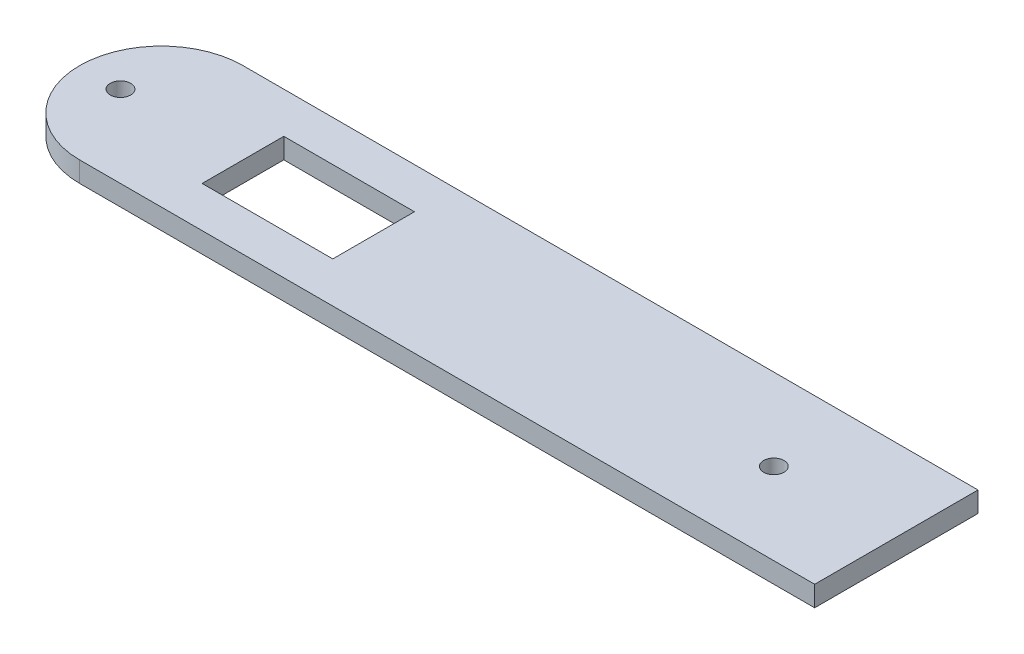
ISO-10303-21;
HEADER;
FILE_DESCRIPTION(('STEP AP214'),'2;1');
FILE_NAME('part.step','',(''),(''),'','','');
FILE_SCHEMA(('AUTOMOTIVE_DESIGN { 1 0 10303 214 1 1 1 1 }'));
ENDSEC;
DATA;
#1=APPLICATION_CONTEXT('core data for automotive mechanical design processes');
#2=APPLICATION_PROTOCOL_DEFINITION('international standard','automotive_design',2000,#1);
#3=PRODUCT_CONTEXT('',#1,'mechanical');
#4=PRODUCT('Part','Part','',(#3));
#5=PRODUCT_RELATED_PRODUCT_CATEGORY('part','',(#4));
#6=PRODUCT_DEFINITION_FORMATION('','',#4);
#7=PRODUCT_DEFINITION_CONTEXT('part definition',#1,'design');
#8=PRODUCT_DEFINITION('design','',#6,#7);
#9=PRODUCT_DEFINITION_SHAPE('','',#8);
#10=(LENGTH_UNIT() NAMED_UNIT(*) SI_UNIT(.MILLI.,.METRE.));
#11=(NAMED_UNIT(*) PLANE_ANGLE_UNIT() SI_UNIT($,.RADIAN.));
#12=(NAMED_UNIT(*) SI_UNIT($,.STERADIAN.) SOLID_ANGLE_UNIT());
#13=UNCERTAINTY_MEASURE_WITH_UNIT(LENGTH_MEASURE(1.E-05),#10,'distance_accuracy_value','');
#14=(GEOMETRIC_REPRESENTATION_CONTEXT(3) GLOBAL_UNCERTAINTY_ASSIGNED_CONTEXT((#13)) GLOBAL_UNIT_ASSIGNED_CONTEXT((#10,
#11,#12)) REPRESENTATION_CONTEXT('',''));
#15=CARTESIAN_POINT('',(0.,0.,0.));
#16=DIRECTION('',(0.,0.,1.));
#17=DIRECTION('',(1.,0.,0.));
#18=AXIS2_PLACEMENT_3D('',#15,#16,#17);
#19=CARTESIAN_POINT('',(-34.1213032581454,6.35,15.4691729323308));
#20=DIRECTION('',(0.,0.,-1.));
#21=DIRECTION('',(-1.,0.,0.));
#22=AXIS2_PLACEMENT_3D('',#19,#20,#21);
#23=PLANE('',#22);
#24=DIRECTION('',(1.,0.,0.));
#25=VECTOR('',#24,1.);
#26=CARTESIAN_POINT('',(-34.1213032581454,6.35,15.4691729323308));
#27=LINE('',#26,#25);
#28=CARTESIAN_POINT('',(-8.72130325814537,6.35,15.4691729323308));
#29=VERTEX_POINT('',#28);
#30=CARTESIAN_POINT('',(219.878696741855,6.35,15.4691729323308));
#31=VERTEX_POINT('',#30);
#32=EDGE_CURVE('E147',#29,#31,#27,.T.);
#33=ORIENTED_EDGE('',*,*,#32,.F.);
#34=DIRECTION('',(0.,-1.,0.));
#35=VECTOR('',#34,1.);
#36=CARTESIAN_POINT('',(-8.72130325814537,6.35,15.4691729323308));
#37=LINE('',#36,#35);
#38=CARTESIAN_POINT('',(-8.72130325814537,0.,15.4691729323308));
#39=VERTEX_POINT('',#38);
#40=EDGE_CURVE('E166',#29,#39,#37,.T.);
#41=ORIENTED_EDGE('',*,*,#40,.T.);
#42=DIRECTION('',(1.,0.,0.));
#43=VECTOR('',#42,1.);
#44=CARTESIAN_POINT('',(-34.1213032581454,0.,15.4691729323308));
#45=LINE('',#44,#43);
#46=CARTESIAN_POINT('',(219.878696741855,0.,15.4691729323308));
#47=VERTEX_POINT('',#46);
#48=EDGE_CURVE('E146',#39,#47,#45,.T.);
#49=ORIENTED_EDGE('',*,*,#48,.T.);
#50=DIRECTION('',(0.,-1.,0.));
#51=VECTOR('',#50,1.);
#52=CARTESIAN_POINT('',(219.878696741855,6.35,15.4691729323308));
#53=LINE('',#52,#51);
#54=EDGE_CURVE('E163',#31,#47,#53,.T.);
#55=ORIENTED_EDGE('',*,*,#54,.F.);
#56=EDGE_LOOP('',(#33,#41,#49,#55));
#57=FACE_BOUND('',#56,.T.);
#58=ADVANCED_FACE('F35',(#57),#23,.F.);
#59=CARTESIAN_POINT('',(219.878696741855,6.35,15.4691729323308));
#60=DIRECTION('',(-1.,0.,0.));
#61=DIRECTION('',(0.,0.,1.));
#62=AXIS2_PLACEMENT_3D('',#59,#60,#61);
#63=PLANE('',#62);
#64=DIRECTION('',(0.,0.,-1.));
#65=VECTOR('',#64,1.);
#66=CARTESIAN_POINT('',(219.878696741855,0.,15.4691729323308));
#67=LINE('',#66,#65);
#68=CARTESIAN_POINT('',(219.878696741855,0.,-35.3308270676692));
#69=VERTEX_POINT('',#68);
#70=EDGE_CURVE('E157',#47,#69,#67,.T.);
#71=ORIENTED_EDGE('',*,*,#70,.T.);
#72=DIRECTION('',(0.,-1.,0.));
#73=VECTOR('',#72,1.);
#74=CARTESIAN_POINT('',(219.878696741855,6.35,-35.3308270676692));
#75=LINE('',#74,#73);
#76=CARTESIAN_POINT('',(219.878696741855,6.35,-35.3308270676692));
#77=VERTEX_POINT('',#76);
#78=EDGE_CURVE('E155',#77,#69,#75,.T.);
#79=ORIENTED_EDGE('',*,*,#78,.F.);
#80=DIRECTION('',(0.,0.,-1.));
#81=VECTOR('',#80,1.);
#82=CARTESIAN_POINT('',(219.878696741855,6.35,15.4691729323308));
#83=LINE('',#82,#81);
#84=EDGE_CURVE('E149',#31,#77,#83,.T.);
#85=ORIENTED_EDGE('',*,*,#84,.F.);
#86=ORIENTED_EDGE('',*,*,#54,.T.);
#87=EDGE_LOOP('',(#71,#79,#85,#86));
#88=FACE_BOUND('',#87,.T.);
#89=ADVANCED_FACE('F204',(#88),#63,.F.);
#90=CARTESIAN_POINT('',(-34.1213032581454,6.35,-35.3308270676692));
#91=DIRECTION('',(0.,0.,1.));
#92=DIRECTION('',(1.,0.,0.));
#93=AXIS2_PLACEMENT_3D('',#90,#91,#92);
#94=PLANE('',#93);
#95=DIRECTION('',(-1.,0.,0.));
#96=VECTOR('',#95,1.);
#97=CARTESIAN_POINT('',(-34.1213032581454,0.,-35.3308270676692));
#98=LINE('',#97,#96);
#99=CARTESIAN_POINT('',(-8.72130325814537,0.,-35.3308270676692));
#100=VERTEX_POINT('',#99);
#101=EDGE_CURVE('E150',#69,#100,#98,.T.);
#102=ORIENTED_EDGE('',*,*,#101,.T.);
#103=DIRECTION('',(0.,-1.,0.));
#104=VECTOR('',#103,1.);
#105=CARTESIAN_POINT('',(-8.72130325814537,6.35,-35.3308270676692));
#106=LINE('',#105,#104);
#107=CARTESIAN_POINT('',(-8.72130325814537,6.35,-35.3308270676692));
#108=VERTEX_POINT('',#107);
#109=EDGE_CURVE('E177',#100,#108,#106,.F.);
#110=ORIENTED_EDGE('',*,*,#109,.T.);
#111=DIRECTION('',(-1.,0.,0.));
#112=VECTOR('',#111,1.);
#113=CARTESIAN_POINT('',(-34.1213032581454,6.35,-35.3308270676692));
#114=LINE('',#113,#112);
#115=EDGE_CURVE('E152',#77,#108,#114,.T.);
#116=ORIENTED_EDGE('',*,*,#115,.F.);
#117=ORIENTED_EDGE('',*,*,#78,.T.);
#118=EDGE_LOOP('',(#102,#110,#116,#117));
#119=FACE_BOUND('',#118,.T.);
#120=ADVANCED_FACE('F210',(#119),#94,.F.);
#121=CARTESIAN_POINT('',(0.,6.35,0.));
#122=DIRECTION('',(0.,-1.,0.));
#123=DIRECTION('',(0.,0.,-1.));
#124=AXIS2_PLACEMENT_3D('',#121,#122,#123);
#125=PLANE('',#124);
#126=DIRECTION('',(1.,0.,0.));
#127=VECTOR('',#126,1.);
#128=CARTESIAN_POINT('',(16.6786967418547,6.35,2.76917293233083));
#129=LINE('',#128,#127);
#130=CARTESIAN_POINT('',(16.6786967418547,6.35,2.76917293233083));
#131=VERTEX_POINT('',#130);
#132=CARTESIAN_POINT('',(57.3186967418547,6.35,2.76917293233083));
#133=VERTEX_POINT('',#132);
#134=EDGE_CURVE('E117',#131,#133,#129,.T.);
#135=ORIENTED_EDGE('',*,*,#134,.F.);
#136=DIRECTION('',(0.,0.,1.));
#137=VECTOR('',#136,1.);
#138=CARTESIAN_POINT('',(16.6786967418547,6.35,-22.6308270676692));
#139=LINE('',#138,#137);
#140=CARTESIAN_POINT('',(16.6786967418547,6.35,-22.6308270676692));
#141=VERTEX_POINT('',#140);
#142=EDGE_CURVE('E50',#141,#131,#139,.T.);
#143=ORIENTED_EDGE('',*,*,#142,.F.);
#144=DIRECTION('',(-1.,0.,0.));
#145=VECTOR('',#144,1.);
#146=CARTESIAN_POINT('',(16.6786967418547,6.35,-22.6308270676692));
#147=LINE('',#146,#145);
#148=CARTESIAN_POINT('',(57.3186967418547,6.35,-22.6308270676692));
#149=VERTEX_POINT('',#148);
#150=EDGE_CURVE('E124',#149,#141,#147,.T.);
#151=ORIENTED_EDGE('',*,*,#150,.F.);
#152=DIRECTION('',(0.,0.,-1.));
#153=VECTOR('',#152,1.);
#154=CARTESIAN_POINT('',(57.3186967418547,6.35,-22.6308270676692));
#155=LINE('',#154,#153);
#156=EDGE_CURVE('E108',#133,#149,#155,.T.);
#157=ORIENTED_EDGE('',*,*,#156,.F.);
#158=EDGE_LOOP('',(#135,#143,#151,#157));
#159=FACE_BOUND('',#158,.T.);
#160=CARTESIAN_POINT('',(-21.4213032581453,6.35,-9.93082706766917));
#161=DIRECTION('',(0.,1.,0.));
#162=DIRECTION('',(0.,0.,1.));
#163=AXIS2_PLACEMENT_3D('',#160,#161,#162);
#164=CIRCLE('',#163,3.17499999999999);
#165=CARTESIAN_POINT('',(-21.4213032581453,6.35,-6.75582706766918));
#166=VERTEX_POINT('',#165);
#167=EDGE_CURVE('E134',#166,#166,#164,.T.);
#168=ORIENTED_EDGE('',*,*,#167,.F.);
#169=EDGE_LOOP('',(#168));
#170=FACE_BOUND('',#169,.T.);
#171=CARTESIAN_POINT('',(181.778696741855,6.35,-9.93082706766917));
#172=DIRECTION('',(0.,1.,0.));
#173=DIRECTION('',(0.,0.,1.));
#174=AXIS2_PLACEMENT_3D('',#171,#172,#173);
#175=CIRCLE('',#174,3.17499999999998);
#176=CARTESIAN_POINT('',(181.778696741855,6.35,-6.75582706766919));
#177=VERTEX_POINT('',#176);
#178=EDGE_CURVE('E140',#177,#177,#175,.T.);
#179=ORIENTED_EDGE('',*,*,#178,.F.);
#180=EDGE_LOOP('',(#179));
#181=FACE_BOUND('',#180,.T.);
#182=CARTESIAN_POINT('',(-8.72130325814537,6.35,-9.93082706766917));
#183=DIRECTION('',(0.,-1.,0.));
#184=DIRECTION('',(0.,0.,-1.));
#185=AXIS2_PLACEMENT_3D('',#182,#183,#184);
#186=CIRCLE('',#185,25.4);
#187=CARTESIAN_POINT('',(-34.1213032581454,6.35,-9.93082706766917));
#188=VERTEX_POINT('',#187);
#189=EDGE_CURVE('E173',#108,#188,#186,.F.);
#190=ORIENTED_EDGE('',*,*,#189,.T.);
#191=CARTESIAN_POINT('',(-8.72130325814537,6.35,-9.93082706766918));
#192=DIRECTION('',(0.,-1.,0.));
#193=DIRECTION('',(0.,0.,-1.));
#194=AXIS2_PLACEMENT_3D('',#191,#192,#193);
#195=CIRCLE('',#194,25.4);
#196=EDGE_CURVE('E175',#188,#29,#195,.F.);
#197=ORIENTED_EDGE('',*,*,#196,.T.);
#198=ORIENTED_EDGE('',*,*,#32,.T.);
#199=ORIENTED_EDGE('',*,*,#84,.T.);
#200=ORIENTED_EDGE('',*,*,#115,.T.);
#201=EDGE_LOOP('',(#190,#197,#198,#199,#200));
#202=FACE_BOUND('',#201,.T.);
#203=ADVANCED_FACE('F121',(#159,#170,#181,#202),#125,.F.);
#204=CARTESIAN_POINT('',(0.,0.,0.));
#205=DIRECTION('',(0.,-1.,0.));
#206=DIRECTION('',(0.,0.,-1.));
#207=AXIS2_PLACEMENT_3D('',#204,#205,#206);
#208=PLANE('',#207);
#209=DIRECTION('',(0.,0.,-1.));
#210=VECTOR('',#209,1.);
#211=CARTESIAN_POINT('',(16.6786967418547,0.,0.));
#212=LINE('',#211,#210);
#213=CARTESIAN_POINT('',(16.6786967418547,0.,2.76917293233083));
#214=VERTEX_POINT('',#213);
#215=CARTESIAN_POINT('',(16.6786967418547,0.,-22.6308270676692));
#216=VERTEX_POINT('',#215);
#217=EDGE_CURVE('E11',#214,#216,#212,.T.);
#218=ORIENTED_EDGE('',*,*,#217,.F.);
#219=DIRECTION('',(-1.,0.,0.));
#220=VECTOR('',#219,1.);
#221=CARTESIAN_POINT('',(0.,0.,2.76917293233083));
#222=LINE('',#221,#220);
#223=CARTESIAN_POINT('',(57.3186967418547,0.,2.76917293233083));
#224=VERTEX_POINT('',#223);
#225=EDGE_CURVE('E179',#224,#214,#222,.T.);
#226=ORIENTED_EDGE('',*,*,#225,.F.);
#227=DIRECTION('',(0.,0.,1.));
#228=VECTOR('',#227,1.);
#229=CARTESIAN_POINT('',(57.3186967418547,0.,0.));
#230=LINE('',#229,#228);
#231=CARTESIAN_POINT('',(57.3186967418547,0.,-22.6308270676692));
#232=VERTEX_POINT('',#231);
#233=EDGE_CURVE('E111',#232,#224,#230,.T.);
#234=ORIENTED_EDGE('',*,*,#233,.F.);
#235=DIRECTION('',(1.,0.,0.));
#236=VECTOR('',#235,1.);
#237=CARTESIAN_POINT('',(0.,0.,-22.6308270676692));
#238=LINE('',#237,#236);
#239=EDGE_CURVE('E43',#216,#232,#238,.T.);
#240=ORIENTED_EDGE('',*,*,#239,.F.);
#241=EDGE_LOOP('',(#218,#226,#234,#240));
#242=FACE_BOUND('',#241,.T.);
#243=CARTESIAN_POINT('',(-21.4213032581453,0.,-9.93082706766917));
#244=DIRECTION('',(0.,1.,0.));
#245=DIRECTION('',(0.,0.,1.));
#246=AXIS2_PLACEMENT_3D('',#243,#244,#245);
#247=CIRCLE('',#246,3.17499999999996);
#248=CARTESIAN_POINT('',(-21.4213032581453,0.,-6.75582706766921));
#249=VERTEX_POINT('',#248);
#250=EDGE_CURVE('E137',#249,#249,#247,.T.);
#251=ORIENTED_EDGE('',*,*,#250,.T.);
#252=EDGE_LOOP('',(#251));
#253=FACE_BOUND('',#252,.T.);
#254=CARTESIAN_POINT('',(181.778696741855,0.,-9.93082706766917));
#255=DIRECTION('',(0.,1.,0.));
#256=DIRECTION('',(0.,0.,1.));
#257=AXIS2_PLACEMENT_3D('',#254,#255,#256);
#258=CIRCLE('',#257,3.17499999999996);
#259=CARTESIAN_POINT('',(181.778696741855,0.,-6.75582706766922));
#260=VERTEX_POINT('',#259);
#261=EDGE_CURVE('E143',#260,#260,#258,.T.);
#262=ORIENTED_EDGE('',*,*,#261,.T.);
#263=EDGE_LOOP('',(#262));
#264=FACE_BOUND('',#263,.T.);
#265=ORIENTED_EDGE('',*,*,#48,.F.);
#266=CARTESIAN_POINT('',(-8.72130325814537,0.,-9.93082706766918));
#267=DIRECTION('',(0.,-1.,0.));
#268=DIRECTION('',(0.,0.,-1.));
#269=AXIS2_PLACEMENT_3D('',#266,#267,#268);
#270=CIRCLE('',#269,25.4);
#271=CARTESIAN_POINT('',(-34.1213032581454,0.,-9.93082706766917));
#272=VERTEX_POINT('',#271);
#273=EDGE_CURVE('E171',#39,#272,#270,.T.);
#274=ORIENTED_EDGE('',*,*,#273,.T.);
#275=CARTESIAN_POINT('',(-8.72130325814537,0.,-9.93082706766917));
#276=DIRECTION('',(0.,-1.,0.));
#277=DIRECTION('',(0.,0.,-1.));
#278=AXIS2_PLACEMENT_3D('',#275,#276,#277);
#279=CIRCLE('',#278,25.4);
#280=EDGE_CURVE('E169',#272,#100,#279,.T.);
#281=ORIENTED_EDGE('',*,*,#280,.T.);
#282=ORIENTED_EDGE('',*,*,#101,.F.);
#283=ORIENTED_EDGE('',*,*,#70,.F.);
#284=EDGE_LOOP('',(#265,#274,#281,#282,#283));
#285=FACE_BOUND('',#284,.T.);
#286=ADVANCED_FACE('F189',(#242,#253,#264,#285),#208,.T.);
#287=CARTESIAN_POINT('',(181.778696741855,6.35,-9.93082706766917));
#288=DIRECTION('',(0.,1.,0.));
#289=DIRECTION('',(0.,0.,1.));
#290=AXIS2_PLACEMENT_3D('',#287,#288,#289);
#291=CYLINDRICAL_SURFACE('',#290,3.17499999999997);
#292=ORIENTED_EDGE('',*,*,#261,.F.);
#293=EDGE_LOOP('',(#292));
#294=FACE_BOUND('',#293,.T.);
#295=ORIENTED_EDGE('',*,*,#178,.T.);
#296=EDGE_LOOP('',(#295));
#297=FACE_BOUND('',#296,.T.);
#298=ADVANCED_FACE('F220',(#294,#297),#291,.F.);
#299=CARTESIAN_POINT('',(-21.4213032581453,6.35,-9.93082706766917));
#300=DIRECTION('',(0.,1.,0.));
#301=DIRECTION('',(0.,0.,1.));
#302=AXIS2_PLACEMENT_3D('',#299,#300,#301);
#303=CYLINDRICAL_SURFACE('',#302,3.17499999999997);
#304=ORIENTED_EDGE('',*,*,#250,.F.);
#305=EDGE_LOOP('',(#304));
#306=FACE_BOUND('',#305,.T.);
#307=ORIENTED_EDGE('',*,*,#167,.T.);
#308=EDGE_LOOP('',(#307));
#309=FACE_BOUND('',#308,.T.);
#310=ADVANCED_FACE('F224',(#306,#309),#303,.F.);
#311=CARTESIAN_POINT('',(-8.72130325814537,6.35,-9.93082706766917));
#312=DIRECTION('',(0.,-1.,0.));
#313=DIRECTION('',(0.,0.,-1.));
#314=AXIS2_PLACEMENT_3D('',#311,#312,#313);
#315=CYLINDRICAL_SURFACE('',#314,25.4);
#316=DIRECTION('',(0.,-1.,0.));
#317=VECTOR('',#316,1.);
#318=CARTESIAN_POINT('',(-34.1213032581454,6.35,-9.93082706766917));
#319=LINE('',#318,#317);
#320=EDGE_CURVE('E131',#188,#272,#319,.T.);
#321=ORIENTED_EDGE('',*,*,#320,.F.);
#322=ORIENTED_EDGE('',*,*,#189,.F.);
#323=ORIENTED_EDGE('',*,*,#109,.F.);
#324=ORIENTED_EDGE('',*,*,#280,.F.);
#325=EDGE_LOOP('',(#321,#322,#323,#324));
#326=FACE_BOUND('',#325,.T.);
#327=ADVANCED_FACE('F37',(#326),#315,.T.);
#328=CARTESIAN_POINT('',(-8.72130325814537,6.35,-9.93082706766918));
#329=DIRECTION('',(0.,-1.,0.));
#330=DIRECTION('',(0.,0.,-1.));
#331=AXIS2_PLACEMENT_3D('',#328,#329,#330);
#332=CYLINDRICAL_SURFACE('',#331,25.4);
#333=ORIENTED_EDGE('',*,*,#196,.F.);
#334=ORIENTED_EDGE('',*,*,#320,.T.);
#335=ORIENTED_EDGE('',*,*,#273,.F.);
#336=ORIENTED_EDGE('',*,*,#40,.F.);
#337=EDGE_LOOP('',(#333,#334,#335,#336));
#338=FACE_BOUND('',#337,.T.);
#339=ADVANCED_FACE('F193',(#338),#332,.T.);
#340=CARTESIAN_POINT('',(16.6786967418547,-19.05,-22.6308270676692));
#341=DIRECTION('',(-1.,0.,0.));
#342=DIRECTION('',(0.,0.,1.));
#343=AXIS2_PLACEMENT_3D('',#340,#341,#342);
#344=PLANE('',#343);
#345=ORIENTED_EDGE('',*,*,#217,.T.);
#346=DIRECTION('',(0.,1.,0.));
#347=VECTOR('',#346,1.);
#348=CARTESIAN_POINT('',(16.6786967418547,-19.05,-22.6308270676692));
#349=LINE('',#348,#347);
#350=EDGE_CURVE('E129',#216,#141,#349,.T.);
#351=ORIENTED_EDGE('',*,*,#350,.T.);
#352=ORIENTED_EDGE('',*,*,#142,.T.);
#353=DIRECTION('',(0.,1.,0.));
#354=VECTOR('',#353,1.);
#355=CARTESIAN_POINT('',(16.6786967418547,-19.05,2.76917293233083));
#356=LINE('',#355,#354);
#357=EDGE_CURVE('E114',#214,#131,#356,.T.);
#358=ORIENTED_EDGE('',*,*,#357,.F.);
#359=EDGE_LOOP('',(#345,#351,#352,#358));
#360=FACE_BOUND('',#359,.T.);
#361=ADVANCED_FACE('F191',(#360),#344,.F.);
#362=CARTESIAN_POINT('',(16.6786967418547,-19.05,-22.6308270676692));
#363=DIRECTION('',(0.,0.,-1.));
#364=DIRECTION('',(-1.,0.,0.));
#365=AXIS2_PLACEMENT_3D('',#362,#363,#364);
#366=PLANE('',#365);
#367=ORIENTED_EDGE('',*,*,#239,.T.);
#368=DIRECTION('',(0.,1.,0.));
#369=VECTOR('',#368,1.);
#370=CARTESIAN_POINT('',(57.3186967418547,-19.05,-22.6308270676692));
#371=LINE('',#370,#369);
#372=EDGE_CURVE('E113',#232,#149,#371,.T.);
#373=ORIENTED_EDGE('',*,*,#372,.T.);
#374=ORIENTED_EDGE('',*,*,#150,.T.);
#375=ORIENTED_EDGE('',*,*,#350,.F.);
#376=EDGE_LOOP('',(#367,#373,#374,#375));
#377=FACE_BOUND('',#376,.T.);
#378=ADVANCED_FACE('F186',(#377),#366,.F.);
#379=CARTESIAN_POINT('',(57.3186967418547,-19.05,-22.6308270676692));
#380=DIRECTION('',(1.,0.,0.));
#381=DIRECTION('',(0.,0.,-1.));
#382=AXIS2_PLACEMENT_3D('',#379,#380,#381);
#383=PLANE('',#382);
#384=ORIENTED_EDGE('',*,*,#233,.T.);
#385=DIRECTION('',(0.,1.,0.));
#386=VECTOR('',#385,1.);
#387=CARTESIAN_POINT('',(57.3186967418547,-19.05,2.76917293233083));
#388=LINE('',#387,#386);
#389=EDGE_CURVE('E58',#224,#133,#388,.T.);
#390=ORIENTED_EDGE('',*,*,#389,.T.);
#391=ORIENTED_EDGE('',*,*,#156,.T.);
#392=ORIENTED_EDGE('',*,*,#372,.F.);
#393=EDGE_LOOP('',(#384,#390,#391,#392));
#394=FACE_BOUND('',#393,.T.);
#395=ADVANCED_FACE('F105',(#394),#383,.F.);
#396=CARTESIAN_POINT('',(16.6786967418547,-19.05,2.76917293233083));
#397=DIRECTION('',(0.,0.,1.));
#398=DIRECTION('',(1.,0.,0.));
#399=AXIS2_PLACEMENT_3D('',#396,#397,#398);
#400=PLANE('',#399);
#401=ORIENTED_EDGE('',*,*,#225,.T.);
#402=ORIENTED_EDGE('',*,*,#357,.T.);
#403=ORIENTED_EDGE('',*,*,#134,.T.);
#404=ORIENTED_EDGE('',*,*,#389,.F.);
#405=EDGE_LOOP('',(#401,#402,#403,#404));
#406=FACE_BOUND('',#405,.T.);
#407=ADVANCED_FACE('F118',(#406),#400,.F.);
#408=CLOSED_SHELL('',(#58,#89,#120,#203,#286,#298,#310,#327,#339,#361,#378,#395,#407));
#409=MANIFOLD_SOLID_BREP('B2',#408);
#410=ADVANCED_BREP_SHAPE_REPRESENTATION('',(#18,#409),#14);
#411=SHAPE_DEFINITION_REPRESENTATION(#9,#410);
ENDSEC;
END-ISO-10303-21;
